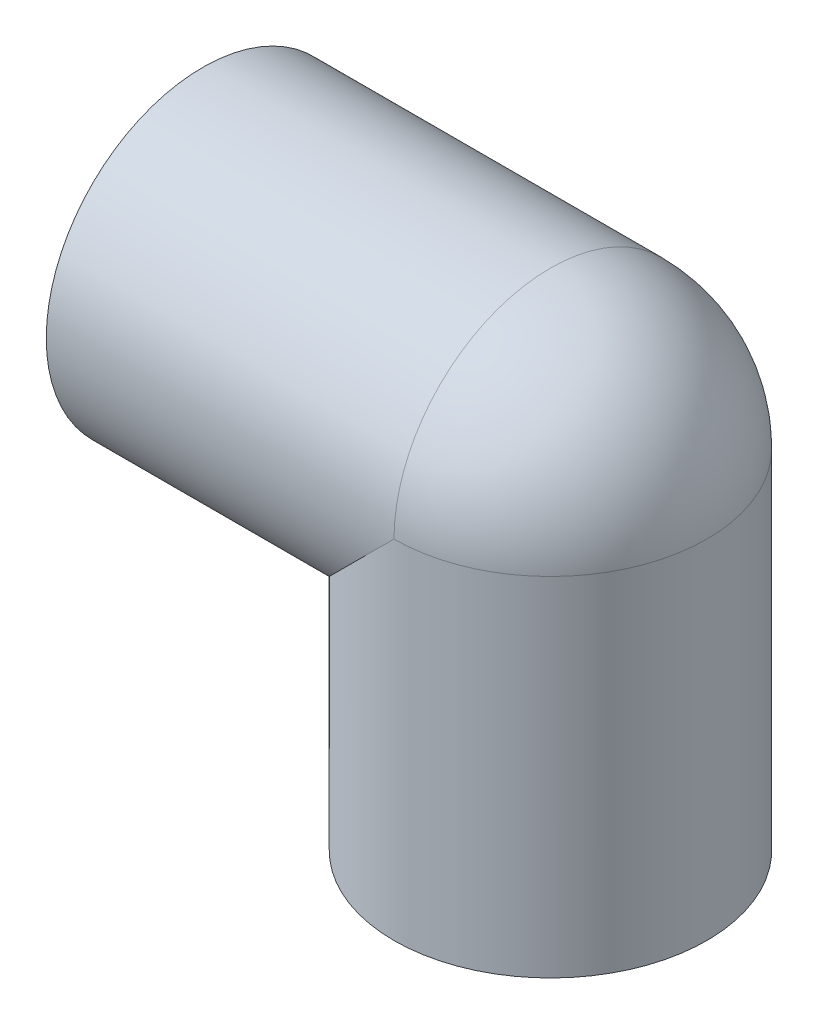
ISO-10303-21;
HEADER;
FILE_DESCRIPTION(('STEP AP214'),'2;1');
FILE_NAME('part.step','',(''),(''),'','','');
FILE_SCHEMA(('AUTOMOTIVE_DESIGN { 1 0 10303 214 1 1 1 1 }'));
ENDSEC;
DATA;
#1=APPLICATION_CONTEXT('core data for automotive mechanical design processes');
#2=APPLICATION_PROTOCOL_DEFINITION('international standard','automotive_design',2000,#1);
#3=PRODUCT_CONTEXT('',#1,'mechanical');
#4=PRODUCT('Part','Part','',(#3));
#5=PRODUCT_RELATED_PRODUCT_CATEGORY('part','',(#4));
#6=PRODUCT_DEFINITION_FORMATION('','',#4);
#7=PRODUCT_DEFINITION_CONTEXT('part definition',#1,'design');
#8=PRODUCT_DEFINITION('design','',#6,#7);
#9=PRODUCT_DEFINITION_SHAPE('','',#8);
#10=(LENGTH_UNIT() NAMED_UNIT(*) SI_UNIT(.MILLI.,.METRE.));
#11=(NAMED_UNIT(*) PLANE_ANGLE_UNIT() SI_UNIT($,.RADIAN.));
#12=(NAMED_UNIT(*) SI_UNIT($,.STERADIAN.) SOLID_ANGLE_UNIT());
#13=UNCERTAINTY_MEASURE_WITH_UNIT(LENGTH_MEASURE(1.E-05),#10,'distance_accuracy_value','');
#14=(GEOMETRIC_REPRESENTATION_CONTEXT(3) GLOBAL_UNCERTAINTY_ASSIGNED_CONTEXT((#13)) GLOBAL_UNIT_ASSIGNED_CONTEXT((#10,
#11,#12)) REPRESENTATION_CONTEXT('',''));
#15=CARTESIAN_POINT('',(0.,0.,0.));
#16=DIRECTION('',(0.,0.,1.));
#17=DIRECTION('',(1.,0.,0.));
#18=AXIS2_PLACEMENT_3D('',#15,#16,#17);
#19=CARTESIAN_POINT('',(-10.31875,0.,0.));
#20=DIRECTION('',(-1.,0.,0.));
#21=DIRECTION('',(0.,0.,1.));
#22=AXIS2_PLACEMENT_3D('',#19,#20,#21);
#23=CYLINDRICAL_SURFACE('',#22,10.715625);
#24=CARTESIAN_POINT('',(-7.31108884584745,-10.31875,2.8892936123082));
#25=CARTESIAN_POINT('',(-7.37676470965549,-10.3652923862018,2.72316357900003));
#26=CARTESIAN_POINT('',(-7.4370910953241,-10.4083383118565,2.5538897210838));
#27=CARTESIAN_POINT('',(-7.54644679958211,-10.4867504316767,2.20990528295751));
#28=CARTESIAN_POINT('',(-7.59547029622774,-10.5221126675546,2.03519195331184));
#29=CARTESIAN_POINT('',(-7.68149317256971,-10.5843777699865,1.6815993986699));
#30=CARTESIAN_POINT('',(-7.71850925771329,-10.611292387679,1.50272633574469));
#31=CARTESIAN_POINT('',(-7.78009613023634,-10.6561732529607,1.14177395605163));
#32=CARTESIAN_POINT('',(-7.80466945369715,-10.6741413240209,0.959695300481976));
#33=CARTESIAN_POINT('',(-7.84108533139287,-10.7007965378428,0.592885916075851));
#34=CARTESIAN_POINT('',(-7.85287921410509,-10.7094481975353,0.408147744495195));
#35=CARTESIAN_POINT('',(-7.86338665734982,-10.7171553304336,0.0381008608052807));
#36=CARTESIAN_POINT('',(-7.86210025793305,-10.7162108330221,-0.147207849555298));
#37=CARTESIAN_POINT('',(-7.84646792033843,-10.704747129626,-0.516898013549607));
#38=CARTESIAN_POINT('',(-7.83212778469885,-10.6942321778205,-0.701279842579086));
#39=CARTESIAN_POINT('',(-7.79063455134412,-10.6638817091505,-1.06774467389616));
#40=CARTESIAN_POINT('',(-7.76348423528215,-10.6440482157549,-1.24982816644462));
#41=CARTESIAN_POINT('',(-7.68346094514594,-10.5857973968144,-1.68228660463246));
#42=CARTESIAN_POINT('',(-7.62465308676712,-10.5431267816673,-1.93103619760143));
#43=CARTESIAN_POINT('',(-7.51945870239575,-10.4673903580287,-2.29649476166364));
#44=CARTESIAN_POINT('',(-7.48157805266509,-10.4402001916382,-2.41699995746123));
#45=CARTESIAN_POINT('',(-7.4003674887322,-10.3821586780859,-2.65526262083744));
#46=CARTESIAN_POINT('',(-7.35703759564644,-10.3513073451116,-2.7730200990617));
#47=CARTESIAN_POINT('',(-7.31108884584745,-10.31875,-2.88929361230819));
#48=B_SPLINE_CURVE_WITH_KNOTS('',3,(#24,#25,#26,#27,#28,#29,#30,#31,#32,#33,#34,#35,#36,#37,#38,
#39,#40,#41,#42,#43,#44,#45,#46,#47),.UNSPECIFIED.,.F.,.F.,(4,2,2,2,2,2,2,2,2,2,2,4),(0.,
0.553743257082809,1.10777110472353,1.66102481557194,2.21416571691722,2.76940597416627,
3.32464453131712,3.87963639889982,4.43450780877978,5.20994695651087,5.5974229306878,
5.98489740339501),.UNSPECIFIED.);
#49=CARTESIAN_POINT('',(-7.31108884584745,-10.31875,2.8892936123082));
#50=VERTEX_POINT('',#49);
#51=CARTESIAN_POINT('',(-7.31108884584745,-10.31875,-2.8892936123082));
#52=VERTEX_POINT('',#51);
#53=EDGE_CURVE('E89',#50,#52,#48,.T.);
#54=ORIENTED_EDGE('',*,*,#53,.F.);
#55=DIRECTION('',(-1.,0.,0.));
#56=VECTOR('',#55,1.);
#57=CARTESIAN_POINT('',(-10.31875,-10.31875,2.8892936123082));
#58=LINE('',#57,#56);
#59=CARTESIAN_POINT('',(-7.50194049775624,-10.31875,2.8892936123082));
#60=VERTEX_POINT('',#59);
#61=EDGE_CURVE('E91',#60,#50,#58,.F.);
#62=ORIENTED_EDGE('',*,*,#61,.F.);
#63=CARTESIAN_POINT('',(-7.50194049775624,-10.31875,2.8892936123082));
#64=CARTESIAN_POINT('',(-7.56703291639195,-10.3660825872091,2.72034393349406));
#65=CARTESIAN_POINT('',(-7.62673688959445,-10.4097702234507,2.54824684605145));
#66=CARTESIAN_POINT('',(-7.73476316025078,-10.4891686265369,2.19862911424315));
#67=CARTESIAN_POINT('',(-7.78307961785428,-10.5248753000282,2.02110573960654));
#68=CARTESIAN_POINT('',(-7.86760153160545,-10.5875329408204,1.66192220134899));
#69=CARTESIAN_POINT('',(-7.90382311761824,-10.6144955678927,1.48026789512067));
#70=CARTESIAN_POINT('',(-7.96373044149858,-10.659178709857,1.11381369448429));
#71=CARTESIAN_POINT('',(-7.98741875337378,-10.6769011224372,0.929014454016855));
#72=CARTESIAN_POINT('',(-8.02197623326521,-10.7027782288099,0.556848215382885));
#73=CARTESIAN_POINT('',(-8.03279712951123,-10.7108968938066,0.369474198989614));
#74=CARTESIAN_POINT('',(-8.04128795973049,-10.7172661814243,-0.00573832804235311));
#75=CARTESIAN_POINT('',(-8.03895791913445,-10.7155168231278,-0.193576837782129));
#76=CARTESIAN_POINT('',(-8.02118630676737,-10.7021906617233,-0.56818608083849));
#77=CARTESIAN_POINT('',(-8.00575162973173,-10.6906190264055,-0.754957323664219));
#78=CARTESIAN_POINT('',(-7.96203654750996,-10.6579223896723,-1.12606791711581));
#79=CARTESIAN_POINT('',(-7.93375919380811,-10.6367996576505,-1.31040783473601));
#80=CARTESIAN_POINT('',(-7.85373036889296,-10.5772222605556,-1.7337947198918));
#81=CARTESIAN_POINT('',(-7.79736725138873,-10.5353875159712,-1.97152378666673));
#82=CARTESIAN_POINT('',(-7.69765414880709,-10.4618772155641,-2.32119894670812));
#83=CARTESIAN_POINT('',(-7.66190773811937,-10.4355948987606,-2.43655424364212));
#84=CARTESIAN_POINT('',(-7.58553714866458,-10.3796528033044,-2.6648122069635));
#85=CARTESIAN_POINT('',(-7.54491276987104,-10.349992886152,-2.77771477254959));
#86=CARTESIAN_POINT('',(-7.50194049775624,-10.31875,-2.8892936123082));
#87=B_SPLINE_CURVE_WITH_KNOTS('',3,(#63,#64,#65,#66,#67,#68,#69,#70,#71,#72,#73,#74,#75,#76,#77,
#78,#79,#80,#81,#82,#83,#84,#85,#86),.UNSPECIFIED.,.F.,.F.,(4,2,2,2,2,2,2,2,2,2,2,4),(0.,
0.561349910285454,1.12298707382537,1.68387221168289,2.24464211360301,2.80750915815595,
3.37037511426015,3.93294511337809,4.49538151292183,5.23733195909952,5.60797600009155,
5.97863524494559),.UNSPECIFIED.);
#88=CARTESIAN_POINT('',(-7.50194049775624,-10.31875,-2.8892936123082));
#89=VERTEX_POINT('',#88);
#90=EDGE_CURVE('E107',#60,#89,#87,.T.);
#91=ORIENTED_EDGE('',*,*,#90,.T.);
#92=DIRECTION('',(-1.,0.,0.));
#93=VECTOR('',#92,1.);
#94=CARTESIAN_POINT('',(-10.31875,-10.31875,-2.8892936123082));
#95=LINE('',#94,#93);
#96=EDGE_CURVE('E94',#52,#89,#95,.T.);
#97=ORIENTED_EDGE('',*,*,#96,.F.);
#98=EDGE_LOOP('',(#54,#62,#91,#97));
#99=FACE_BOUND('',#98,.T.);
#100=ADVANCED_FACE('F36',(#99),#23,.T.);
#101=CARTESIAN_POINT('',(0.,0.,0.));
#102=DIRECTION('',(0.,1.,0.));
#103=DIRECTION('',(0.,0.,1.));
#104=AXIS2_PLACEMENT_3D('',#101,#102,#103);
#105=CYLINDRICAL_SURFACE('',#104,10.715625);
#106=CARTESIAN_POINT('',(-10.31875,-7.31108884584745,-2.88929361230822));
#107=CARTESIAN_POINT('',(-10.3652923862018,-7.37676470965548,-2.72316357900005));
#108=CARTESIAN_POINT('',(-10.4083383118565,-7.4370910953241,-2.55388972108381));
#109=CARTESIAN_POINT('',(-10.4867504316767,-7.54644679958211,-2.20990528295753));
#110=CARTESIAN_POINT('',(-10.5221126675546,-7.59547029622774,-2.03519195331185));
#111=CARTESIAN_POINT('',(-10.5843777699865,-7.68149317256971,-1.68159939866991));
#112=CARTESIAN_POINT('',(-10.611292387679,-7.71850925771329,-1.5027263357447));
#113=CARTESIAN_POINT('',(-10.6561732529607,-7.78009613023634,-1.14177395605164));
#114=CARTESIAN_POINT('',(-10.6741413240209,-7.80466945369715,-0.959695300481991));
#115=CARTESIAN_POINT('',(-10.7007965378428,-7.84108533139287,-0.592885916075866));
#116=CARTESIAN_POINT('',(-10.7094481975353,-7.8528792141051,-0.40814774449521));
#117=CARTESIAN_POINT('',(-10.7171553304336,-7.86338665734982,-0.0381008608052962));
#118=CARTESIAN_POINT('',(-10.7162108330221,-7.86210025793305,0.147207849555283));
#119=CARTESIAN_POINT('',(-10.704747129626,-7.84646792033843,0.516898013549592));
#120=CARTESIAN_POINT('',(-10.6942321778205,-7.83212778469885,0.701279842579071));
#121=CARTESIAN_POINT('',(-10.6638817091505,-7.79063455134412,1.06774467389614));
#122=CARTESIAN_POINT('',(-10.6440482157549,-7.76348423528215,1.2498281664446));
#123=CARTESIAN_POINT('',(-10.5857973968144,-7.68346094514595,1.68228660463245));
#124=CARTESIAN_POINT('',(-10.5431267816673,-7.62465308676713,1.93103619760143));
#125=CARTESIAN_POINT('',(-10.4673903580287,-7.51945870239575,2.29649476166365));
#126=CARTESIAN_POINT('',(-10.4402001916382,-7.48157805266509,2.41699995746124));
#127=CARTESIAN_POINT('',(-10.3821586780859,-7.4003674887322,2.65526262083745));
#128=CARTESIAN_POINT('',(-10.3513073451116,-7.35703759564644,2.77302009906171));
#129=CARTESIAN_POINT('',(-10.31875,-7.31108884584745,2.88929361230821));
#130=B_SPLINE_CURVE_WITH_KNOTS('',3,(#106,#107,#108,#109,#110,#111,#112,#113,#114,#115,#116,
#117,#118,#119,#120,#121,#122,#123,#124,#125,#126,#127,#128,#129),.UNSPECIFIED.,.F.,.F.,(4,2,2,
2,2,2,2,2,2,2,2,4),(0.,0.55374325708281,1.10777110472353,1.66102481557194,2.21416571691722,
2.76940597416627,3.32464453131712,3.87963639889982,4.43450780877978,5.20994695651088,
5.59742293068783,5.98489740339504),.UNSPECIFIED.);
#131=CARTESIAN_POINT('',(-10.31875,-7.31108884584745,-2.88929361230821));
#132=VERTEX_POINT('',#131);
#133=CARTESIAN_POINT('',(-10.31875,-7.31108884584745,2.88929361230821));
#134=VERTEX_POINT('',#133);
#135=EDGE_CURVE('E154',#132,#134,#130,.T.);
#136=ORIENTED_EDGE('',*,*,#135,.F.);
#137=DIRECTION('',(0.,1.,0.));
#138=VECTOR('',#137,1.);
#139=CARTESIAN_POINT('',(-10.31875,0.,-2.88929361230821));
#140=LINE('',#139,#138);
#141=CARTESIAN_POINT('',(-10.31875,-7.50194049775623,-2.88929361230821));
#142=VERTEX_POINT('',#141);
#143=EDGE_CURVE('E112',#142,#132,#140,.T.);
#144=ORIENTED_EDGE('',*,*,#143,.F.);
#145=CARTESIAN_POINT('',(-10.31875,-7.50194049775623,2.88929361230821));
#146=CARTESIAN_POINT('',(-10.3660825872091,-7.56703291639195,2.72034393349406));
#147=CARTESIAN_POINT('',(-10.4097702234507,-7.62673688959445,2.54824684605146));
#148=CARTESIAN_POINT('',(-10.4891686265369,-7.73476316025078,2.19862911424316));
#149=CARTESIAN_POINT('',(-10.5248753000282,-7.78307961785428,2.02110573960655));
#150=CARTESIAN_POINT('',(-10.5875329408204,-7.86760153160545,1.66192220134899));
#151=CARTESIAN_POINT('',(-10.6144955678927,-7.90382311761824,1.48026789512068));
#152=CARTESIAN_POINT('',(-10.659178709857,-7.96373044149857,1.11381369448429));
#153=CARTESIAN_POINT('',(-10.6769011224372,-7.98741875337377,0.929014454016862));
#154=CARTESIAN_POINT('',(-10.7027782288099,-8.0219762332652,0.556848215382892));
#155=CARTESIAN_POINT('',(-10.7108968938066,-8.03279712951123,0.369474198989621));
#156=CARTESIAN_POINT('',(-10.7172661814243,-8.04128795973048,-0.00573832804234663));
#157=CARTESIAN_POINT('',(-10.7155168231278,-8.03895791913445,-0.193576837782123));
#158=CARTESIAN_POINT('',(-10.7021906617233,-8.02118630676736,-0.568186080838484));
#159=CARTESIAN_POINT('',(-10.6906190264055,-8.00575162973172,-0.754957323664213));
#160=CARTESIAN_POINT('',(-10.6579223896723,-7.96203654750995,-1.1260679171158));
#161=CARTESIAN_POINT('',(-10.6367996576505,-7.93375919380811,-1.31040783473601));
#162=CARTESIAN_POINT('',(-10.5772222605556,-7.85373036889295,-1.73379471989179));
#163=CARTESIAN_POINT('',(-10.5353875159712,-7.79736725138872,-1.97152378666673));
#164=CARTESIAN_POINT('',(-10.4618772155641,-7.69765414880709,-2.32119894670813));
#165=CARTESIAN_POINT('',(-10.4355948987606,-7.66190773811936,-2.43655424364212));
#166=CARTESIAN_POINT('',(-10.3796528033044,-7.58553714866458,-2.66481220696351));
#167=CARTESIAN_POINT('',(-10.349992886152,-7.54491276987104,-2.7777147725496));
#168=CARTESIAN_POINT('',(-10.31875,-7.50194049775623,-2.88929361230821));
#169=B_SPLINE_CURVE_WITH_KNOTS('',3,(#145,#146,#147,#148,#149,#150,#151,#152,#153,#154,#155,
#156,#157,#158,#159,#160,#161,#162,#163,#164,#165,#166,#167,#168),.UNSPECIFIED.,.F.,.F.,(4,2,2,
2,2,2,2,2,2,2,2,4),(0.,0.561349910285455,1.12298707382537,1.68387221168289,2.24464211360301,
2.80750915815596,3.37037511426015,3.93294511337809,4.49538151292184,5.23733195909953,
5.60797600009157,5.9786352449456),.UNSPECIFIED.);
#170=CARTESIAN_POINT('',(-10.31875,-7.50194049775623,2.88929361230821));
#171=VERTEX_POINT('',#170);
#172=EDGE_CURVE('E111',#171,#142,#169,.T.);
#173=ORIENTED_EDGE('',*,*,#172,.F.);
#174=DIRECTION('',(0.,1.,0.));
#175=VECTOR('',#174,1.);
#176=CARTESIAN_POINT('',(-10.31875,0.,2.88929361230821));
#177=LINE('',#176,#175);
#178=EDGE_CURVE('E106',#134,#171,#177,.F.);
#179=ORIENTED_EDGE('',*,*,#178,.F.);
#180=EDGE_LOOP('',(#136,#144,#173,#179));
#181=FACE_BOUND('',#180,.T.);
#182=ADVANCED_FACE('F146',(#181),#105,.T.);
#183=CARTESIAN_POINT('',(0.,-23.8125,0.));
#184=DIRECTION('',(0.,1.,0.));
#185=DIRECTION('',(0.,0.,1.));
#186=AXIS2_PLACEMENT_3D('',#183,#184,#185);
#187=CIRCLE('',#186,10.715625);
#188=CARTESIAN_POINT('',(0.,-23.8125,10.715625));
#189=VERTEX_POINT('',#188);
#190=EDGE_CURVE('E197',#189,#189,#187,.T.);
#191=ORIENTED_EDGE('',*,*,#190,.T.);
#192=EDGE_LOOP('',(#191));
#193=FACE_BOUND('',#192,.T.);
#194=CARTESIAN_POINT('',(0.,0.,0.));
#195=DIRECTION('',(-0.707106781186547,0.707106781186547,0.));
#196=DIRECTION('',(-0.707106781186547,-0.707106781186547,0.));
#197=AXIS2_PLACEMENT_3D('',#194,#195,#196);
#198=ELLIPSE('',#197,15.1541822043042,10.715625);
#199=CARTESIAN_POINT('',(0.,0.,10.715625));
#200=VERTEX_POINT('',#199);
#201=CARTESIAN_POINT('',(0.,0.,-10.715625));
#202=VERTEX_POINT('',#201);
#203=EDGE_CURVE('E11',#200,#202,#198,.F.);
#204=ORIENTED_EDGE('',*,*,#203,.T.);
#205=CARTESIAN_POINT('',(0.,0.,0.));
#206=DIRECTION('',(0.,1.,0.));
#207=DIRECTION('',(0.,0.,1.));
#208=AXIS2_PLACEMENT_3D('',#205,#206,#207);
#209=CIRCLE('',#208,10.715625);
#210=EDGE_CURVE('E218',#200,#202,#209,.T.);
#211=ORIENTED_EDGE('',*,*,#210,.F.);
#212=EDGE_LOOP('',(#204,#211));
#213=FACE_BOUND('',#212,.T.);
#214=ADVANCED_FACE('F150',(#193,#213),#105,.T.);
#215=CARTESIAN_POINT('',(0.,0.,0.));
#216=DIRECTION('',(0.,1.,0.));
#217=DIRECTION('',(0.,0.,1.));
#218=AXIS2_PLACEMENT_3D('',#215,#216,#217);
#219=CYLINDRICAL_SURFACE('',#218,8.0391);
#220=CARTESIAN_POINT('',(0.,-23.8125,0.));
#221=DIRECTION('',(0.,1.,0.));
#222=DIRECTION('',(0.,0.,1.));
#223=AXIS2_PLACEMENT_3D('',#220,#221,#222);
#224=CIRCLE('',#223,8.0391);
#225=CARTESIAN_POINT('',(0.,-23.8125,8.0391));
#226=VERTEX_POINT('',#225);
#227=EDGE_CURVE('E194',#226,#226,#224,.T.);
#228=ORIENTED_EDGE('',*,*,#227,.F.);
#229=EDGE_LOOP('',(#228));
#230=FACE_BOUND('',#229,.T.);
#231=ORIENTED_EDGE('',*,*,#90,.F.);
#232=CARTESIAN_POINT('',(0.,-10.31875,0.));
#233=DIRECTION('',(0.,-1.,0.));
#234=DIRECTION('',(0.,0.,-1.));
#235=AXIS2_PLACEMENT_3D('',#232,#233,#234);
#236=CIRCLE('',#235,8.0391);
#237=EDGE_CURVE('E105',#60,#89,#236,.F.);
#238=ORIENTED_EDGE('',*,*,#237,.T.);
#239=EDGE_LOOP('',(#231,#238));
#240=FACE_BOUND('',#239,.T.);
#241=ADVANCED_FACE('F175',(#230,#240),#219,.F.);
#242=CARTESIAN_POINT('',(0.,-10.31875,10.715625));
#243=DIRECTION('',(0.,-1.,0.));
#244=DIRECTION('',(0.,0.,-1.));
#245=AXIS2_PLACEMENT_3D('',#242,#243,#244);
#246=PLANE('',#245);
#247=ORIENTED_EDGE('',*,*,#237,.F.);
#248=ORIENTED_EDGE('',*,*,#61,.T.);
#249=CARTESIAN_POINT('',(0.,-10.31875,0.));
#250=DIRECTION('',(0.,1.,0.));
#251=DIRECTION('',(0.,0.,1.));
#252=AXIS2_PLACEMENT_3D('',#249,#250,#251);
#253=CIRCLE('',#252,7.8613);
#254=EDGE_CURVE('E103',#50,#52,#253,.T.);
#255=ORIENTED_EDGE('',*,*,#254,.T.);
#256=ORIENTED_EDGE('',*,*,#96,.T.);
#257=EDGE_LOOP('',(#247,#248,#255,#256));
#258=FACE_BOUND('',#257,.T.);
#259=ADVANCED_FACE('F102',(#258),#246,.T.);
#260=CARTESIAN_POINT('',(0.,0.,0.));
#261=DIRECTION('',(0.,1.,0.));
#262=DIRECTION('',(0.,0.,1.));
#263=AXIS2_PLACEMENT_3D('',#260,#261,#262);
#264=CYLINDRICAL_SURFACE('',#263,7.8613);
#265=ORIENTED_EDGE('',*,*,#254,.F.);
#266=ORIENTED_EDGE('',*,*,#53,.T.);
#267=EDGE_LOOP('',(#265,#266));
#268=FACE_BOUND('',#267,.T.);
#269=CARTESIAN_POINT('',(0.,0.,0.));
#270=DIRECTION('',(0.,-1.,0.));
#271=DIRECTION('',(0.,0.,1.));
#272=AXIS2_PLACEMENT_3D('',#269,#270,#271);
#273=CIRCLE('',#272,7.8613);
#274=CARTESIAN_POINT('',(0.,0.,-7.8613));
#275=VERTEX_POINT('',#274);
#276=CARTESIAN_POINT('',(0.,0.,7.8613));
#277=VERTEX_POINT('',#276);
#278=EDGE_CURVE('E220',#275,#277,#273,.T.);
#279=ORIENTED_EDGE('',*,*,#278,.F.);
#280=CARTESIAN_POINT('',(0.,0.,0.));
#281=DIRECTION('',(0.707106781186547,-0.707106781186547,0.));
#282=DIRECTION('',(0.707106781186547,0.707106781186547,0.));
#283=AXIS2_PLACEMENT_3D('',#280,#281,#282);
#284=ELLIPSE('',#283,11.1175570778836,7.8613);
#285=EDGE_CURVE('E98',#277,#275,#284,.T.);
#286=ORIENTED_EDGE('',*,*,#285,.F.);
#287=EDGE_LOOP('',(#279,#286));
#288=FACE_BOUND('',#287,.T.);
#289=ADVANCED_FACE('F109',(#268,#288),#264,.F.);
#290=CARTESIAN_POINT('',(-34.1881983594151,0.,0.));
#291=DIRECTION('',(-1.,0.,0.));
#292=DIRECTION('',(0.,0.,1.));
#293=AXIS2_PLACEMENT_3D('',#290,#291,#292);
#294=CYLINDRICAL_SURFACE('',#293,10.715625);
#295=ORIENTED_EDGE('',*,*,#203,.F.);
#296=CARTESIAN_POINT('',(0.,0.,0.));
#297=DIRECTION('',(1.,0.,0.));
#298=DIRECTION('',(0.,0.,-1.));
#299=AXIS2_PLACEMENT_3D('',#296,#297,#298);
#300=CIRCLE('',#299,10.715625);
#301=EDGE_CURVE('E223',#202,#200,#300,.T.);
#302=ORIENTED_EDGE('',*,*,#301,.F.);
#303=EDGE_LOOP('',(#295,#302));
#304=FACE_BOUND('',#303,.T.);
#305=CARTESIAN_POINT('',(-23.8125,0.,0.));
#306=DIRECTION('',(-1.,0.,0.));
#307=DIRECTION('',(0.,0.,1.));
#308=AXIS2_PLACEMENT_3D('',#305,#306,#307);
#309=CIRCLE('',#308,10.715625);
#310=CARTESIAN_POINT('',(-23.8125,0.,10.715625));
#311=VERTEX_POINT('',#310);
#312=EDGE_CURVE('E192',#311,#311,#309,.T.);
#313=ORIENTED_EDGE('',*,*,#312,.F.);
#314=EDGE_LOOP('',(#313));
#315=FACE_BOUND('',#314,.T.);
#316=ADVANCED_FACE('F179',(#304,#315),#294,.T.);
#317=CARTESIAN_POINT('',(-23.8125,10.715625,0.));
#318=DIRECTION('',(1.,0.,0.));
#319=DIRECTION('',(0.,0.,-1.));
#320=AXIS2_PLACEMENT_3D('',#317,#318,#319);
#321=PLANE('',#320);
#322=CARTESIAN_POINT('',(-23.8125,0.,0.));
#323=DIRECTION('',(-1.,0.,0.));
#324=DIRECTION('',(0.,0.,1.));
#325=AXIS2_PLACEMENT_3D('',#322,#323,#324);
#326=CIRCLE('',#325,8.0391);
#327=CARTESIAN_POINT('',(-23.8125,0.,8.0391));
#328=VERTEX_POINT('',#327);
#329=EDGE_CURVE('E46',#328,#328,#326,.T.);
#330=ORIENTED_EDGE('',*,*,#329,.F.);
#331=EDGE_LOOP('',(#330));
#332=FACE_BOUND('',#331,.T.);
#333=ORIENTED_EDGE('',*,*,#312,.T.);
#334=EDGE_LOOP('',(#333));
#335=FACE_BOUND('',#334,.T.);
#336=ADVANCED_FACE('F38',(#332,#335),#321,.F.);
#337=CARTESIAN_POINT('',(-34.1881983594151,0.,0.));
#338=DIRECTION('',(-1.,0.,0.));
#339=DIRECTION('',(0.,0.,1.));
#340=AXIS2_PLACEMENT_3D('',#337,#338,#339);
#341=CYLINDRICAL_SURFACE('',#340,8.0391);
#342=CARTESIAN_POINT('',(-10.31875,0.,0.));
#343=DIRECTION('',(-1.,0.,0.));
#344=DIRECTION('',(0.,0.,1.));
#345=AXIS2_PLACEMENT_3D('',#342,#343,#344);
#346=CIRCLE('',#345,8.0391);
#347=EDGE_CURVE('E40',#171,#142,#346,.T.);
#348=ORIENTED_EDGE('',*,*,#347,.F.);
#349=ORIENTED_EDGE('',*,*,#172,.T.);
#350=EDGE_LOOP('',(#348,#349));
#351=FACE_BOUND('',#350,.T.);
#352=ORIENTED_EDGE('',*,*,#329,.T.);
#353=EDGE_LOOP('',(#352));
#354=FACE_BOUND('',#353,.T.);
#355=ADVANCED_FACE('F123',(#351,#354),#341,.F.);
#356=CARTESIAN_POINT('',(8.0391,-23.8125,0.));
#357=DIRECTION('',(0.,1.,0.));
#358=DIRECTION('',(0.,0.,1.));
#359=AXIS2_PLACEMENT_3D('',#356,#357,#358);
#360=PLANE('',#359);
#361=ORIENTED_EDGE('',*,*,#190,.F.);
#362=EDGE_LOOP('',(#361));
#363=FACE_BOUND('',#362,.T.);
#364=ORIENTED_EDGE('',*,*,#227,.T.);
#365=EDGE_LOOP('',(#364));
#366=FACE_BOUND('',#365,.T.);
#367=ADVANCED_FACE('F138',(#363,#366),#360,.F.);
#368=CARTESIAN_POINT('',(-10.31875,0.,-10.715625));
#369=DIRECTION('',(1.,0.,0.));
#370=DIRECTION('',(0.,0.,-1.));
#371=AXIS2_PLACEMENT_3D('',#368,#369,#370);
#372=PLANE('',#371);
#373=CARTESIAN_POINT('',(-10.31875,0.,0.));
#374=DIRECTION('',(1.,0.,0.));
#375=DIRECTION('',(0.,0.,-1.));
#376=AXIS2_PLACEMENT_3D('',#373,#374,#375);
#377=CIRCLE('',#376,7.8613);
#378=EDGE_CURVE('E227',#132,#134,#377,.T.);
#379=ORIENTED_EDGE('',*,*,#378,.T.);
#380=ORIENTED_EDGE('',*,*,#178,.T.);
#381=ORIENTED_EDGE('',*,*,#347,.T.);
#382=ORIENTED_EDGE('',*,*,#143,.T.);
#383=EDGE_LOOP('',(#379,#380,#381,#382));
#384=FACE_BOUND('',#383,.T.);
#385=ADVANCED_FACE('F134',(#384),#372,.F.);
#386=CARTESIAN_POINT('',(0.,0.,0.));
#387=DIRECTION('',(1.,0.,0.));
#388=DIRECTION('',(0.,0.,-1.));
#389=AXIS2_PLACEMENT_3D('',#386,#387,#388);
#390=SPHERICAL_SURFACE('',#389,10.715625);
#391=ORIENTED_EDGE('',*,*,#210,.T.);
#392=ORIENTED_EDGE('',*,*,#301,.T.);
#393=EDGE_LOOP('',(#391,#392));
#394=FACE_BOUND('',#393,.T.);
#395=ADVANCED_FACE('F130',(#394),#390,.T.);
#396=CARTESIAN_POINT('',(0.,0.,0.));
#397=DIRECTION('',(1.,0.,0.));
#398=DIRECTION('',(0.,0.,-1.));
#399=AXIS2_PLACEMENT_3D('',#396,#397,#398);
#400=SPHERICAL_SURFACE('',#399,7.8613);
#401=CARTESIAN_POINT('',(0.,0.,0.));
#402=DIRECTION('',(1.,0.,0.));
#403=DIRECTION('',(0.,0.,-1.));
#404=AXIS2_PLACEMENT_3D('',#401,#402,#403);
#405=CIRCLE('',#404,7.8613);
#406=EDGE_CURVE('E230',#275,#277,#405,.T.);
#407=ORIENTED_EDGE('',*,*,#406,.F.);
#408=ORIENTED_EDGE('',*,*,#278,.T.);
#409=EDGE_LOOP('',(#407,#408));
#410=FACE_BOUND('',#409,.T.);
#411=ADVANCED_FACE('F133',(#410),#400,.F.);
#412=CARTESIAN_POINT('',(-10.31875,0.,0.));
#413=DIRECTION('',(1.,0.,0.));
#414=DIRECTION('',(0.,0.,-1.));
#415=AXIS2_PLACEMENT_3D('',#412,#413,#414);
#416=CYLINDRICAL_SURFACE('',#415,7.8613);
#417=ORIENTED_EDGE('',*,*,#378,.F.);
#418=ORIENTED_EDGE('',*,*,#135,.T.);
#419=EDGE_LOOP('',(#417,#418));
#420=FACE_BOUND('',#419,.T.);
#421=ORIENTED_EDGE('',*,*,#406,.T.);
#422=ORIENTED_EDGE('',*,*,#285,.T.);
#423=EDGE_LOOP('',(#421,#422));
#424=FACE_BOUND('',#423,.T.);
#425=ADVANCED_FACE('F139',(#420,#424),#416,.F.);
#426=CLOSED_SHELL('',(#100,#182,#214,#241,#259,#289,#316,#336,#355,#367,#385,#395,#411,#425));
#427=MANIFOLD_SOLID_BREP('B2',#426);
#428=ADVANCED_BREP_SHAPE_REPRESENTATION('',(#18,#427),#14);
#429=SHAPE_DEFINITION_REPRESENTATION(#9,#428);
ENDSEC;
END-ISO-10303-21;
